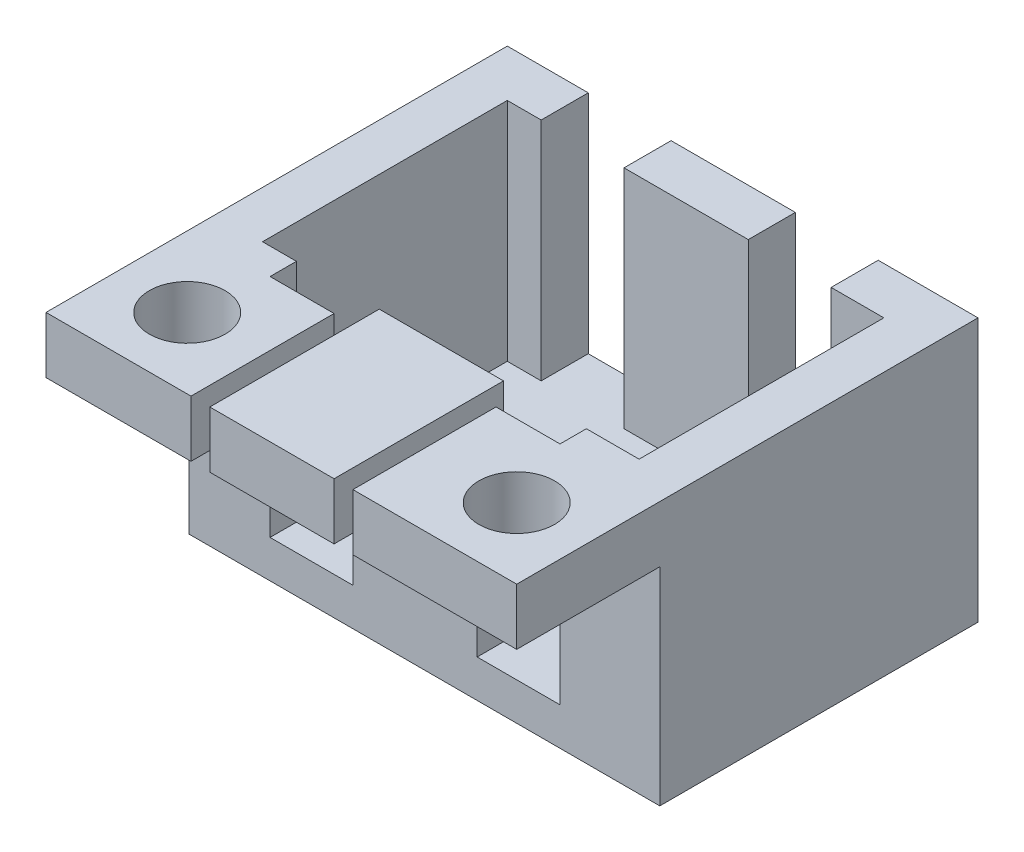
ISO-10303-21;
HEADER;
FILE_DESCRIPTION(('STEP AP214'),'2;1');
FILE_NAME('part.step','',(''),(''),'','','');
FILE_SCHEMA(('AUTOMOTIVE_DESIGN { 1 0 10303 214 1 1 1 1 }'));
ENDSEC;
DATA;
#1=APPLICATION_CONTEXT('core data for automotive mechanical design processes');
#2=APPLICATION_PROTOCOL_DEFINITION('international standard','automotive_design',2000,#1);
#3=PRODUCT_CONTEXT('',#1,'mechanical');
#4=PRODUCT('Part','Part','',(#3));
#5=PRODUCT_RELATED_PRODUCT_CATEGORY('part','',(#4));
#6=PRODUCT_DEFINITION_FORMATION('','',#4);
#7=PRODUCT_DEFINITION_CONTEXT('part definition',#1,'design');
#8=PRODUCT_DEFINITION('design','',#6,#7);
#9=PRODUCT_DEFINITION_SHAPE('','',#8);
#10=(LENGTH_UNIT() NAMED_UNIT(*) SI_UNIT(.MILLI.,.METRE.));
#11=(NAMED_UNIT(*) PLANE_ANGLE_UNIT() SI_UNIT($,.RADIAN.));
#12=(NAMED_UNIT(*) SI_UNIT($,.STERADIAN.) SOLID_ANGLE_UNIT());
#13=UNCERTAINTY_MEASURE_WITH_UNIT(LENGTH_MEASURE(1.E-05),#10,'distance_accuracy_value','');
#14=(GEOMETRIC_REPRESENTATION_CONTEXT(3) GLOBAL_UNCERTAINTY_ASSIGNED_CONTEXT((#13)) GLOBAL_UNIT_ASSIGNED_CONTEXT((#10,
#11,#12)) REPRESENTATION_CONTEXT('',''));
#15=CARTESIAN_POINT('',(0.,0.,0.));
#16=DIRECTION('',(0.,0.,1.));
#17=DIRECTION('',(1.,0.,0.));
#18=AXIS2_PLACEMENT_3D('',#15,#16,#17);
#19=CARTESIAN_POINT('',(-15.875,16.51,8.9535));
#20=DIRECTION('',(0.,1.,0.));
#21=DIRECTION('',(0.,0.,1.));
#22=AXIS2_PLACEMENT_3D('',#19,#20,#21);
#23=PLANE('',#22);
#24=DIRECTION('',(-1.,0.,0.));
#25=VECTOR('',#24,1.);
#26=CARTESIAN_POINT('',(-15.875,16.51,20.3835));
#27=LINE('',#26,#25);
#28=CARTESIAN_POINT('',(3.556,16.51,20.3835));
#29=VERTEX_POINT('',#28);
#30=CARTESIAN_POINT('',(-4.826,16.51,20.3835));
#31=VERTEX_POINT('',#30);
#32=EDGE_CURVE('E268',#29,#31,#27,.T.);
#33=ORIENTED_EDGE('',*,*,#32,.F.);
#34=DIRECTION('',(0.,0.,-1.));
#35=VECTOR('',#34,1.);
#36=CARTESIAN_POINT('',(3.556,16.51,10.7315));
#37=LINE('',#36,#35);
#38=CARTESIAN_POINT('',(3.556,16.51,8.9535));
#39=VERTEX_POINT('',#38);
#40=EDGE_CURVE('E249',#29,#39,#37,.T.);
#41=ORIENTED_EDGE('',*,*,#40,.T.);
#42=DIRECTION('',(-1.,0.,0.));
#43=VECTOR('',#42,1.);
#44=CARTESIAN_POINT('',(-15.875,16.51,8.9535));
#45=LINE('',#44,#43);
#46=CARTESIAN_POINT('',(-4.826,16.51,8.9535));
#47=VERTEX_POINT('',#46);
#48=EDGE_CURVE('E596',#39,#47,#45,.T.);
#49=ORIENTED_EDGE('',*,*,#48,.T.);
#50=DIRECTION('',(0.,0.,-1.));
#51=VECTOR('',#50,1.);
#52=CARTESIAN_POINT('',(-4.826,16.51,10.7315));
#53=LINE('',#52,#51);
#54=EDGE_CURVE('E274',#31,#47,#53,.T.);
#55=ORIENTED_EDGE('',*,*,#54,.F.);
#56=EDGE_LOOP('',(#33,#41,#49,#55));
#57=FACE_BOUND('',#56,.T.);
#58=ADVANCED_FACE('F36',(#57),#23,.T.);
#59=CARTESIAN_POINT('',(-15.875,12.7,20.3835));
#60=DIRECTION('',(0.,1.,0.));
#61=DIRECTION('',(0.,0.,1.));
#62=AXIS2_PLACEMENT_3D('',#59,#60,#61);
#63=PLANE('',#62);
#64=DIRECTION('',(1.,0.,0.));
#65=VECTOR('',#64,1.);
#66=CARTESIAN_POINT('',(-15.875,12.7,10.7315));
#67=LINE('',#66,#65);
#68=CARTESIAN_POINT('',(-4.826,12.7,10.7315));
#69=VERTEX_POINT('',#68);
#70=CARTESIAN_POINT('',(3.556,12.7,10.7315));
#71=VERTEX_POINT('',#70);
#72=EDGE_CURVE('E290',#69,#71,#67,.T.);
#73=ORIENTED_EDGE('',*,*,#72,.T.);
#74=DIRECTION('',(0.,0.,1.));
#75=VECTOR('',#74,1.);
#76=CARTESIAN_POINT('',(3.556,12.7,20.3835));
#77=LINE('',#76,#75);
#78=CARTESIAN_POINT('',(3.556,12.7,20.3835));
#79=VERTEX_POINT('',#78);
#80=EDGE_CURVE('E493',#71,#79,#77,.T.);
#81=ORIENTED_EDGE('',*,*,#80,.T.);
#82=DIRECTION('',(1.,0.,0.));
#83=VECTOR('',#82,1.);
#84=CARTESIAN_POINT('',(-15.875,12.7,20.3835));
#85=LINE('',#84,#83);
#86=CARTESIAN_POINT('',(-4.826,12.7,20.3835));
#87=VERTEX_POINT('',#86);
#88=EDGE_CURVE('E271',#87,#79,#85,.T.);
#89=ORIENTED_EDGE('',*,*,#88,.F.);
#90=DIRECTION('',(0.,0.,-1.));
#91=VECTOR('',#90,1.);
#92=CARTESIAN_POINT('',(-4.826,12.7,20.3835));
#93=LINE('',#92,#91);
#94=EDGE_CURVE('E501',#87,#69,#93,.T.);
#95=ORIENTED_EDGE('',*,*,#94,.T.);
#96=EDGE_LOOP('',(#73,#81,#89,#95));
#97=FACE_BOUND('',#96,.T.);
#98=ADVANCED_FACE('F532',(#97),#63,.F.);
#99=CARTESIAN_POINT('',(0.,0.,20.3835));
#100=DIRECTION('',(0.,0.,1.));
#101=DIRECTION('',(1.,0.,0.));
#102=AXIS2_PLACEMENT_3D('',#99,#100,#101);
#103=PLANE('',#102);
#104=DIRECTION('',(0.,1.,0.));
#105=VECTOR('',#104,1.);
#106=CARTESIAN_POINT('',(3.556,-1.270025,20.3835));
#107=LINE('',#106,#105);
#108=EDGE_CURVE('E252',#79,#29,#107,.T.);
#109=ORIENTED_EDGE('',*,*,#108,.T.);
#110=ORIENTED_EDGE('',*,*,#32,.T.);
#111=DIRECTION('',(0.,1.,0.));
#112=VECTOR('',#111,1.);
#113=CARTESIAN_POINT('',(-4.826,0.,20.3835));
#114=LINE('',#113,#112);
#115=EDGE_CURVE('E44',#87,#31,#114,.T.);
#116=ORIENTED_EDGE('',*,*,#115,.F.);
#117=ORIENTED_EDGE('',*,*,#88,.T.);
#118=EDGE_LOOP('',(#109,#110,#116,#117));
#119=FACE_BOUND('',#118,.T.);
#120=ADVANCED_FACE('F266',(#119),#103,.T.);
#121=DIRECTION('',(0.,0.,-1.));
#122=VECTOR('',#121,1.);
#123=CARTESIAN_POINT('',(4.826,16.51,10.7315));
#124=LINE('',#123,#122);
#125=CARTESIAN_POINT('',(4.826,16.51,20.3835));
#126=VERTEX_POINT('',#125);
#127=CARTESIAN_POINT('',(4.826,16.51,10.7315));
#128=VERTEX_POINT('',#127);
#129=EDGE_CURVE('E51',#126,#128,#124,.T.);
#130=ORIENTED_EDGE('',*,*,#129,.F.);
#131=CARTESIAN_POINT('',(15.875,16.51,20.3835));
#132=VERTEX_POINT('',#131);
#133=EDGE_CURVE('E276',#132,#126,#27,.T.);
#134=ORIENTED_EDGE('',*,*,#133,.F.);
#135=DIRECTION('',(0.,0.,1.));
#136=VECTOR('',#135,1.);
#137=CARTESIAN_POINT('',(15.875,16.51,8.9535));
#138=LINE('',#137,#136);
#139=CARTESIAN_POINT('',(15.875,16.51,-10.7315));
#140=VERTEX_POINT('',#139);
#141=EDGE_CURVE('E446',#140,#132,#138,.T.);
#142=ORIENTED_EDGE('',*,*,#141,.F.);
#143=DIRECTION('',(1.,0.,0.));
#144=VECTOR('',#143,1.);
#145=CARTESIAN_POINT('',(15.875,16.51,-10.7315));
#146=LINE('',#145,#144);
#147=CARTESIAN_POINT('',(9.144,16.51,-10.7315));
#148=VERTEX_POINT('',#147);
#149=EDGE_CURVE('E393',#148,#140,#146,.T.);
#150=ORIENTED_EDGE('',*,*,#149,.F.);
#151=DIRECTION('',(0.,0.,-1.));
#152=VECTOR('',#151,1.);
#153=CARTESIAN_POINT('',(9.144,16.51,10.7315));
#154=LINE('',#153,#152);
#155=CARTESIAN_POINT('',(9.144,16.51,-7.5565));
#156=VERTEX_POINT('',#155);
#157=EDGE_CURVE('E261',#156,#148,#154,.T.);
#158=ORIENTED_EDGE('',*,*,#157,.F.);
#159=DIRECTION('',(1.,0.,0.));
#160=VECTOR('',#159,1.);
#161=CARTESIAN_POINT('',(-500000.,16.5100000002277,-7.5565));
#162=LINE('',#161,#160);
#163=CARTESIAN_POINT('',(12.7,16.51,-7.5565));
#164=VERTEX_POINT('',#163);
#165=EDGE_CURVE('E370',#156,#164,#162,.T.);
#166=ORIENTED_EDGE('',*,*,#165,.T.);
#167=DIRECTION('',(0.,0.,1.));
#168=VECTOR('',#167,1.);
#169=CARTESIAN_POINT('',(12.7,16.51,-10.7315));
#170=LINE('',#169,#168);
#171=CARTESIAN_POINT('',(12.7,16.51,8.9535));
#172=VERTEX_POINT('',#171);
#173=EDGE_CURVE('E391',#164,#172,#170,.T.);
#174=ORIENTED_EDGE('',*,*,#173,.T.);
#175=CARTESIAN_POINT('',(9.144,16.51,8.9535));
#176=VERTEX_POINT('',#175);
#177=EDGE_CURVE('E403',#172,#176,#45,.T.);
#178=ORIENTED_EDGE('',*,*,#177,.T.);
#179=CARTESIAN_POINT('',(9.144,16.51,10.7315));
#180=VERTEX_POINT('',#179);
#181=EDGE_CURVE('E340',#180,#176,#154,.T.);
#182=ORIENTED_EDGE('',*,*,#181,.F.);
#183=DIRECTION('',(-1.,0.,0.));
#184=VECTOR('',#183,1.);
#185=CARTESIAN_POINT('',(-15.875,16.51,10.7315));
#186=LINE('',#185,#184);
#187=EDGE_CURVE('E464',#180,#128,#186,.T.);
#188=ORIENTED_EDGE('',*,*,#187,.T.);
#189=EDGE_LOOP('',(#130,#134,#142,#150,#158,#166,#174,#178,#182,#188));
#190=FACE_BOUND('',#189,.T.);
#191=CARTESIAN_POINT('',(11.1125,16.51,15.621));
#192=DIRECTION('',(0.,1.,0.));
#193=DIRECTION('',(0.,0.,1.));
#194=AXIS2_PLACEMENT_3D('',#191,#192,#193);
#195=CIRCLE('',#194,2.55269999999999);
#196=CARTESIAN_POINT('',(11.1125,16.51,18.1737));
#197=VERTEX_POINT('',#196);
#198=EDGE_CURVE('E503',#197,#197,#195,.T.);
#199=ORIENTED_EDGE('',*,*,#198,.F.);
#200=EDGE_LOOP('',(#199));
#201=FACE_BOUND('',#200,.T.);
#202=ADVANCED_FACE('F482',(#190,#201),#23,.T.);
#203=CARTESIAN_POINT('',(11.1125,12.7,15.621));
#204=DIRECTION('',(0.,1.,0.));
#205=DIRECTION('',(0.,0.,1.));
#206=AXIS2_PLACEMENT_3D('',#203,#204,#205);
#207=CIRCLE('',#206,2.55269999999999);
#208=CARTESIAN_POINT('',(11.1125,12.7,18.1737));
#209=VERTEX_POINT('',#208);
#210=EDGE_CURVE('E506',#209,#209,#207,.T.);
#211=ORIENTED_EDGE('',*,*,#210,.T.);
#212=EDGE_LOOP('',(#211));
#213=FACE_BOUND('',#212,.T.);
#214=CARTESIAN_POINT('',(4.826,12.7,20.3835));
#215=VERTEX_POINT('',#214);
#216=CARTESIAN_POINT('',(15.875,12.7,20.3835));
#217=VERTEX_POINT('',#216);
#218=EDGE_CURVE('E463',#215,#217,#85,.T.);
#219=ORIENTED_EDGE('',*,*,#218,.F.);
#220=DIRECTION('',(0.,0.,-1.));
#221=VECTOR('',#220,1.);
#222=CARTESIAN_POINT('',(4.826,12.7,20.3835));
#223=LINE('',#222,#221);
#224=CARTESIAN_POINT('',(4.826,12.7,10.7315));
#225=VERTEX_POINT('',#224);
#226=EDGE_CURVE('E489',#215,#225,#223,.T.);
#227=ORIENTED_EDGE('',*,*,#226,.T.);
#228=CARTESIAN_POINT('',(9.144,12.7,10.7315));
#229=VERTEX_POINT('',#228);
#230=EDGE_CURVE('E285',#225,#229,#67,.T.);
#231=ORIENTED_EDGE('',*,*,#230,.T.);
#232=CARTESIAN_POINT('',(15.875,12.7,10.7315));
#233=VERTEX_POINT('',#232);
#234=EDGE_CURVE('E295',#229,#233,#67,.T.);
#235=ORIENTED_EDGE('',*,*,#234,.T.);
#236=DIRECTION('',(0.,0.,-1.));
#237=VECTOR('',#236,1.);
#238=CARTESIAN_POINT('',(15.875,12.7,20.3835));
#239=LINE('',#238,#237);
#240=EDGE_CURVE('E280',#217,#233,#239,.T.);
#241=ORIENTED_EDGE('',*,*,#240,.F.);
#242=EDGE_LOOP('',(#219,#227,#231,#235,#241));
#243=FACE_BOUND('',#242,.T.);
#244=ADVANCED_FACE('F539',(#213,#243),#63,.F.);
#245=DIRECTION('',(0.,1.,0.));
#246=VECTOR('',#245,1.);
#247=CARTESIAN_POINT('',(4.826,-1.270025,20.3835));
#248=LINE('',#247,#246);
#249=EDGE_CURVE('E272',#215,#126,#248,.T.);
#250=ORIENTED_EDGE('',*,*,#249,.F.);
#251=ORIENTED_EDGE('',*,*,#218,.T.);
#252=DIRECTION('',(0.,1.,0.));
#253=VECTOR('',#252,1.);
#254=CARTESIAN_POINT('',(15.875,16.51,20.3835));
#255=LINE('',#254,#253);
#256=EDGE_CURVE('E281',#217,#132,#255,.T.);
#257=ORIENTED_EDGE('',*,*,#256,.T.);
#258=ORIENTED_EDGE('',*,*,#133,.T.);
#259=EDGE_LOOP('',(#250,#251,#257,#258));
#260=FACE_BOUND('',#259,.T.);
#261=ADVANCED_FACE('F475',(#260),#103,.T.);
#262=CARTESIAN_POINT('',(-15.875,1.27,10.7315));
#263=DIRECTION('',(0.,0.,-1.));
#264=DIRECTION('',(-1.,0.,0.));
#265=AXIS2_PLACEMENT_3D('',#262,#263,#264);
#266=PLANE('',#265);
#267=DIRECTION('',(-1.,0.,0.));
#268=VECTOR('',#267,1.);
#269=CARTESIAN_POINT('',(9.144,1.27,10.7315));
#270=LINE('',#269,#268);
#271=CARTESIAN_POINT('',(9.144,1.27,10.7315));
#272=VERTEX_POINT('',#271);
#273=CARTESIAN_POINT('',(3.556,1.27000000000001,10.7315));
#274=VERTEX_POINT('',#273);
#275=EDGE_CURVE('E625',#272,#274,#270,.T.);
#276=ORIENTED_EDGE('',*,*,#275,.T.);
#277=DIRECTION('',(0.,1.,0.));
#278=VECTOR('',#277,1.);
#279=CARTESIAN_POINT('',(3.556,16.51,10.7315));
#280=LINE('',#279,#278);
#281=EDGE_CURVE('E627',#274,#71,#280,.T.);
#282=ORIENTED_EDGE('',*,*,#281,.T.);
#283=ORIENTED_EDGE('',*,*,#72,.F.);
#284=DIRECTION('',(0.,-1.,0.));
#285=VECTOR('',#284,1.);
#286=CARTESIAN_POINT('',(-4.826,16.51,10.7315));
#287=LINE('',#286,#285);
#288=CARTESIAN_POINT('',(-4.826,1.27000000000001,10.7315));
#289=VERTEX_POINT('',#288);
#290=EDGE_CURVE('E332',#69,#289,#287,.T.);
#291=ORIENTED_EDGE('',*,*,#290,.T.);
#292=DIRECTION('',(-1.,0.,0.));
#293=VECTOR('',#292,1.);
#294=CARTESIAN_POINT('',(-4.826,1.27000000000001,10.7315));
#295=LINE('',#294,#293);
#296=CARTESIAN_POINT('',(-10.414,1.27000000000001,10.7315));
#297=VERTEX_POINT('',#296);
#298=EDGE_CURVE('E316',#289,#297,#295,.T.);
#299=ORIENTED_EDGE('',*,*,#298,.T.);
#300=DIRECTION('',(0.,1.,0.));
#301=VECTOR('',#300,1.);
#302=CARTESIAN_POINT('',(-10.414,16.51,10.7315));
#303=LINE('',#302,#301);
#304=CARTESIAN_POINT('',(-10.414,12.7,10.7315));
#305=VERTEX_POINT('',#304);
#306=EDGE_CURVE('E315',#297,#305,#303,.T.);
#307=ORIENTED_EDGE('',*,*,#306,.T.);
#308=CARTESIAN_POINT('',(-15.875,12.7,10.7315));
#309=VERTEX_POINT('',#308);
#310=EDGE_CURVE('E299',#309,#305,#67,.T.);
#311=ORIENTED_EDGE('',*,*,#310,.F.);
#312=DIRECTION('',(0.,-1.,0.));
#313=VECTOR('',#312,1.);
#314=CARTESIAN_POINT('',(-15.875,1.27,10.7315));
#315=LINE('',#314,#313);
#316=CARTESIAN_POINT('',(-15.875,-1.27,10.7315));
#317=VERTEX_POINT('',#316);
#318=EDGE_CURVE('E423',#309,#317,#315,.T.);
#319=ORIENTED_EDGE('',*,*,#318,.T.);
#320=DIRECTION('',(1.,0.,0.));
#321=VECTOR('',#320,1.);
#322=CARTESIAN_POINT('',(-15.875,-1.27,10.7315));
#323=LINE('',#322,#321);
#324=CARTESIAN_POINT('',(15.875,-1.27,10.7315));
#325=VERTEX_POINT('',#324);
#326=EDGE_CURVE('E440',#317,#325,#323,.T.);
#327=ORIENTED_EDGE('',*,*,#326,.T.);
#328=DIRECTION('',(0.,-1.,0.));
#329=VECTOR('',#328,1.);
#330=CARTESIAN_POINT('',(15.875,1.27,10.7315));
#331=LINE('',#330,#329);
#332=EDGE_CURVE('E425',#233,#325,#331,.T.);
#333=ORIENTED_EDGE('',*,*,#332,.F.);
#334=ORIENTED_EDGE('',*,*,#234,.F.);
#335=DIRECTION('',(0.,-1.,0.));
#336=VECTOR('',#335,1.);
#337=CARTESIAN_POINT('',(9.144,16.51,10.7315));
#338=LINE('',#337,#336);
#339=EDGE_CURVE('E622',#229,#272,#338,.T.);
#340=ORIENTED_EDGE('',*,*,#339,.T.);
#341=EDGE_LOOP('',(#276,#282,#283,#291,#299,#307,#311,#319,#327,#333,#334,#340));
#342=FACE_BOUND('',#341,.T.);
#343=ADVANCED_FACE('F568',(#342),#266,.F.);
#344=CARTESIAN_POINT('',(0.,0.,8.9535));
#345=DIRECTION('',(0.,0.,-1.));
#346=DIRECTION('',(-1.,0.,0.));
#347=AXIS2_PLACEMENT_3D('',#344,#345,#346);
#348=PLANE('',#347);
#349=DIRECTION('',(0.,-1.,0.));
#350=VECTOR('',#349,1.);
#351=CARTESIAN_POINT('',(-4.826,0.,8.9535));
#352=LINE('',#351,#350);
#353=CARTESIAN_POINT('',(-4.826,1.27,8.9535));
#354=VERTEX_POINT('',#353);
#355=EDGE_CURVE('E616',#47,#354,#352,.T.);
#356=ORIENTED_EDGE('',*,*,#355,.F.);
#357=ORIENTED_EDGE('',*,*,#48,.F.);
#358=DIRECTION('',(0.,1.,0.));
#359=VECTOR('',#358,1.);
#360=CARTESIAN_POINT('',(3.556,0.,8.9535));
#361=LINE('',#360,#359);
#362=CARTESIAN_POINT('',(3.556,1.27000000000001,8.9535));
#363=VERTEX_POINT('',#362);
#364=EDGE_CURVE('E256',#363,#39,#361,.T.);
#365=ORIENTED_EDGE('',*,*,#364,.F.);
#366=DIRECTION('',(1.,0.,0.));
#367=VECTOR('',#366,1.);
#368=CARTESIAN_POINT('',(-15.875,1.27,8.9535));
#369=LINE('',#368,#367);
#370=EDGE_CURVE('E415',#354,#363,#369,.T.);
#371=ORIENTED_EDGE('',*,*,#370,.F.);
#372=EDGE_LOOP('',(#356,#357,#365,#371));
#373=FACE_BOUND('',#372,.T.);
#374=ADVANCED_FACE('F560',(#373),#348,.T.);
#375=CARTESIAN_POINT('',(-4.826,16.51,-7.5565));
#376=VERTEX_POINT('',#375);
#377=CARTESIAN_POINT('',(-4.826,16.51,-10.7315));
#378=VERTEX_POINT('',#377);
#379=EDGE_CURVE('E333',#376,#378,#53,.T.);
#380=ORIENTED_EDGE('',*,*,#379,.F.);
#381=CARTESIAN_POINT('',(3.556,16.51,-7.5565));
#382=VERTEX_POINT('',#381);
#383=EDGE_CURVE('E376',#376,#382,#162,.T.);
#384=ORIENTED_EDGE('',*,*,#383,.T.);
#385=CARTESIAN_POINT('',(3.556,16.51,-10.7315));
#386=VERTEX_POINT('',#385);
#387=EDGE_CURVE('E262',#382,#386,#37,.T.);
#388=ORIENTED_EDGE('',*,*,#387,.T.);
#389=EDGE_CURVE('E392',#378,#386,#146,.T.);
#390=ORIENTED_EDGE('',*,*,#389,.F.);
#391=EDGE_LOOP('',(#380,#384,#388,#390));
#392=FACE_BOUND('',#391,.T.);
#393=ADVANCED_FACE('F543',(#392),#23,.T.);
#394=CARTESIAN_POINT('',(-500000.,16.5100000002277,-7.5565));
#395=DIRECTION('',(0.,0.,-1.));
#396=DIRECTION('',(0.,1.,0.));
#397=AXIS2_PLACEMENT_3D('',#394,#395,#396);
#398=PLANE('',#397);
#399=ORIENTED_EDGE('',*,*,#383,.F.);
#400=DIRECTION('',(0.,-1.,0.));
#401=VECTOR('',#400,1.);
#402=CARTESIAN_POINT('',(-4.82599999998001,16.5100000002277,-7.5565));
#403=LINE('',#402,#401);
#404=CARTESIAN_POINT('',(-4.826,1.27,-7.5565));
#405=VERTEX_POINT('',#404);
#406=EDGE_CURVE('E420',#376,#405,#403,.T.);
#407=ORIENTED_EDGE('',*,*,#406,.T.);
#408=DIRECTION('',(1.,0.,0.));
#409=VECTOR('',#408,1.);
#410=CARTESIAN_POINT('',(-500000.,1.27000000022766,-7.5565));
#411=LINE('',#410,#409);
#412=CARTESIAN_POINT('',(3.55600000000322,1.27,-7.5565));
#413=VERTEX_POINT('',#412);
#414=EDGE_CURVE('E371',#405,#413,#411,.T.);
#415=ORIENTED_EDGE('',*,*,#414,.T.);
#416=DIRECTION('',(0.,1.,0.));
#417=VECTOR('',#416,1.);
#418=CARTESIAN_POINT('',(3.55600000000322,16.5100000002277,-7.5565));
#419=LINE('',#418,#417);
#420=EDGE_CURVE('E424',#413,#382,#419,.T.);
#421=ORIENTED_EDGE('',*,*,#420,.T.);
#422=EDGE_LOOP('',(#399,#407,#415,#421));
#423=FACE_BOUND('',#422,.T.);
#424=ADVANCED_FACE('F554',(#423),#398,.F.);
#425=DIRECTION('',(0.,-1.,0.));
#426=VECTOR('',#425,1.);
#427=CARTESIAN_POINT('',(9.144,0.,8.9535));
#428=LINE('',#427,#426);
#429=CARTESIAN_POINT('',(9.144,1.27,8.9535));
#430=VERTEX_POINT('',#429);
#431=EDGE_CURVE('E361',#176,#430,#428,.T.);
#432=ORIENTED_EDGE('',*,*,#431,.F.);
#433=ORIENTED_EDGE('',*,*,#177,.F.);
#434=DIRECTION('',(0.,1.,0.));
#435=VECTOR('',#434,1.);
#436=CARTESIAN_POINT('',(12.7,16.51,8.9535));
#437=LINE('',#436,#435);
#438=CARTESIAN_POINT('',(12.7,1.27,8.9535));
#439=VERTEX_POINT('',#438);
#440=EDGE_CURVE('E387',#439,#172,#437,.T.);
#441=ORIENTED_EDGE('',*,*,#440,.F.);
#442=EDGE_CURVE('E400',#430,#439,#369,.T.);
#443=ORIENTED_EDGE('',*,*,#442,.F.);
#444=EDGE_LOOP('',(#432,#433,#441,#443));
#445=FACE_BOUND('',#444,.T.);
#446=ADVANCED_FACE('F566',(#445),#348,.T.);
#447=ORIENTED_EDGE('',*,*,#165,.F.);
#448=DIRECTION('',(0.,-1.,0.));
#449=VECTOR('',#448,1.);
#450=CARTESIAN_POINT('',(9.14399999999205,16.5100000002277,-7.5565));
#451=LINE('',#450,#449);
#452=CARTESIAN_POINT('',(9.144,1.27,-7.5565));
#453=VERTEX_POINT('',#452);
#454=EDGE_CURVE('E416',#156,#453,#451,.T.);
#455=ORIENTED_EDGE('',*,*,#454,.T.);
#456=CARTESIAN_POINT('',(12.7,1.27,-7.5565));
#457=VERTEX_POINT('',#456);
#458=EDGE_CURVE('E366',#453,#457,#411,.T.);
#459=ORIENTED_EDGE('',*,*,#458,.T.);
#460=DIRECTION('',(0.,1.,0.));
#461=VECTOR('',#460,1.);
#462=CARTESIAN_POINT('',(12.7,16.51,-7.5565));
#463=LINE('',#462,#461);
#464=EDGE_CURVE('E363',#457,#164,#463,.T.);
#465=ORIENTED_EDGE('',*,*,#464,.T.);
#466=EDGE_LOOP('',(#447,#455,#459,#465));
#467=FACE_BOUND('',#466,.T.);
#468=ADVANCED_FACE('F555',(#467),#398,.F.);
#469=CARTESIAN_POINT('',(0.,1.27,0.));
#470=DIRECTION('',(0.,1.,0.));
#471=DIRECTION('',(0.,0.,1.));
#472=AXIS2_PLACEMENT_3D('',#469,#470,#471);
#473=PLANE('',#472);
#474=CARTESIAN_POINT('',(-12.7,1.27,8.9535));
#475=VERTEX_POINT('',#474);
#476=CARTESIAN_POINT('',(-10.414,1.27,8.9535));
#477=VERTEX_POINT('',#476);
#478=EDGE_CURVE('E408',#475,#477,#369,.T.);
#479=ORIENTED_EDGE('',*,*,#478,.T.);
#480=DIRECTION('',(0.,0.,-1.));
#481=VECTOR('',#480,1.);
#482=CARTESIAN_POINT('',(-10.414,1.27000000000001,10.7315));
#483=LINE('',#482,#481);
#484=EDGE_CURVE('E607',#297,#477,#483,.T.);
#485=ORIENTED_EDGE('',*,*,#484,.F.);
#486=ORIENTED_EDGE('',*,*,#298,.F.);
#487=DIRECTION('',(0.,0.,-1.));
#488=VECTOR('',#487,1.);
#489=CARTESIAN_POINT('',(-4.826,1.27000000000001,10.7315));
#490=LINE('',#489,#488);
#491=EDGE_CURVE('E621',#289,#354,#490,.T.);
#492=ORIENTED_EDGE('',*,*,#491,.T.);
#493=ORIENTED_EDGE('',*,*,#370,.T.);
#494=DIRECTION('',(0.,0.,-1.));
#495=VECTOR('',#494,1.);
#496=CARTESIAN_POINT('',(3.556,1.27000000000001,10.7315));
#497=LINE('',#496,#495);
#498=EDGE_CURVE('E353',#274,#363,#497,.T.);
#499=ORIENTED_EDGE('',*,*,#498,.F.);
#500=ORIENTED_EDGE('',*,*,#275,.F.);
#501=DIRECTION('',(0.,0.,-1.));
#502=VECTOR('',#501,1.);
#503=CARTESIAN_POINT('',(9.144,1.27,10.7315));
#504=LINE('',#503,#502);
#505=EDGE_CURVE('E356',#272,#430,#504,.T.);
#506=ORIENTED_EDGE('',*,*,#505,.T.);
#507=ORIENTED_EDGE('',*,*,#442,.T.);
#508=DIRECTION('',(0.,0.,1.));
#509=VECTOR('',#508,1.);
#510=CARTESIAN_POINT('',(12.7,1.27,-10.7315));
#511=LINE('',#510,#509);
#512=EDGE_CURVE('E397',#457,#439,#511,.T.);
#513=ORIENTED_EDGE('',*,*,#512,.F.);
#514=ORIENTED_EDGE('',*,*,#458,.F.);
#515=CARTESIAN_POINT('',(9.144,1.27,-10.7315));
#516=VERTEX_POINT('',#515);
#517=EDGE_CURVE('E359',#453,#516,#504,.T.);
#518=ORIENTED_EDGE('',*,*,#517,.T.);
#519=DIRECTION('',(-1.,0.,0.));
#520=VECTOR('',#519,1.);
#521=CARTESIAN_POINT('',(9.144,1.27,-10.7315));
#522=LINE('',#521,#520);
#523=CARTESIAN_POINT('',(3.556,1.27,-10.7315));
#524=VERTEX_POINT('',#523);
#525=EDGE_CURVE('E631',#516,#524,#522,.T.);
#526=ORIENTED_EDGE('',*,*,#525,.T.);
#527=EDGE_CURVE('E355',#413,#524,#497,.T.);
#528=ORIENTED_EDGE('',*,*,#527,.F.);
#529=ORIENTED_EDGE('',*,*,#414,.F.);
#530=CARTESIAN_POINT('',(-4.826,1.27,-10.7315));
#531=VERTEX_POINT('',#530);
#532=EDGE_CURVE('E323',#405,#531,#490,.T.);
#533=ORIENTED_EDGE('',*,*,#532,.T.);
#534=DIRECTION('',(-1.,0.,0.));
#535=VECTOR('',#534,1.);
#536=CARTESIAN_POINT('',(-4.826,1.27,-10.7315));
#537=LINE('',#536,#535);
#538=CARTESIAN_POINT('',(-10.414,1.27,-10.7315));
#539=VERTEX_POINT('',#538);
#540=EDGE_CURVE('E327',#531,#539,#537,.T.);
#541=ORIENTED_EDGE('',*,*,#540,.T.);
#542=CARTESIAN_POINT('',(-10.4140000000257,1.27000000000001,-7.5565));
#543=VERTEX_POINT('',#542);
#544=EDGE_CURVE('E1004',#543,#539,#483,.T.);
#545=ORIENTED_EDGE('',*,*,#544,.F.);
#546=CARTESIAN_POINT('',(-12.6999999999953,1.27000000000001,-7.5565));
#547=VERTEX_POINT('',#546);
#548=EDGE_CURVE('E367',#547,#543,#411,.T.);
#549=ORIENTED_EDGE('',*,*,#548,.F.);
#550=DIRECTION('',(0.,0.,1.));
#551=VECTOR('',#550,1.);
#552=CARTESIAN_POINT('',(-12.7,1.27,-10.7315));
#553=LINE('',#552,#551);
#554=EDGE_CURVE('E382',#547,#475,#553,.T.);
#555=ORIENTED_EDGE('',*,*,#554,.T.);
#556=EDGE_LOOP('',(#479,#485,#486,#492,#493,#499,#500,#506,#507,#513,#514,#518,#526,#528,#529,
#533,#541,#545,#549,#555));
#557=FACE_BOUND('',#556,.T.);
#558=ADVANCED_FACE('F605',(#557),#473,.T.);
#559=CARTESIAN_POINT('',(12.7,16.51,-10.7315));
#560=DIRECTION('',(1.,0.,0.));
#561=DIRECTION('',(0.,0.,-1.));
#562=AXIS2_PLACEMENT_3D('',#559,#560,#561);
#563=PLANE('',#562);
#564=ORIENTED_EDGE('',*,*,#464,.F.);
#565=ORIENTED_EDGE('',*,*,#512,.T.);
#566=ORIENTED_EDGE('',*,*,#440,.T.);
#567=ORIENTED_EDGE('',*,*,#173,.F.);
#568=EDGE_LOOP('',(#564,#565,#566,#567));
#569=FACE_BOUND('',#568,.T.);
#570=ADVANCED_FACE('F590',(#569),#563,.F.);
#571=CARTESIAN_POINT('',(-12.7,16.51,-10.7315));
#572=DIRECTION('',(-1.,0.,0.));
#573=DIRECTION('',(0.,0.,1.));
#574=AXIS2_PLACEMENT_3D('',#571,#572,#573);
#575=PLANE('',#574);
#576=DIRECTION('',(0.,1.,0.));
#577=VECTOR('',#576,1.);
#578=CARTESIAN_POINT('',(-12.6999999999953,16.5100000002277,-7.5565));
#579=LINE('',#578,#577);
#580=CARTESIAN_POINT('',(-12.6999999999953,16.51,-7.5565));
#581=VERTEX_POINT('',#580);
#582=EDGE_CURVE('E375',#547,#581,#579,.T.);
#583=ORIENTED_EDGE('',*,*,#582,.T.);
#584=DIRECTION('',(0.,0.,1.));
#585=VECTOR('',#584,1.);
#586=CARTESIAN_POINT('',(-12.7,16.51,-10.7315));
#587=LINE('',#586,#585);
#588=CARTESIAN_POINT('',(-12.7,16.51,8.9535));
#589=VERTEX_POINT('',#588);
#590=EDGE_CURVE('E384',#581,#589,#587,.T.);
#591=ORIENTED_EDGE('',*,*,#590,.T.);
#592=DIRECTION('',(0.,-1.,0.));
#593=VECTOR('',#592,1.);
#594=CARTESIAN_POINT('',(-12.7,16.51,8.9535));
#595=LINE('',#594,#593);
#596=EDGE_CURVE('E379',#589,#475,#595,.T.);
#597=ORIENTED_EDGE('',*,*,#596,.T.);
#598=ORIENTED_EDGE('',*,*,#554,.F.);
#599=EDGE_LOOP('',(#583,#591,#597,#598));
#600=FACE_BOUND('',#599,.T.);
#601=ADVANCED_FACE('F831',(#600),#575,.F.);
#602=DIRECTION('',(0.,1.,0.));
#603=VECTOR('',#602,1.);
#604=CARTESIAN_POINT('',(-10.414,0.,8.9535));
#605=LINE('',#604,#603);
#606=CARTESIAN_POINT('',(-10.414,16.51,8.9535));
#607=VERTEX_POINT('',#606);
#608=EDGE_CURVE('E339',#477,#607,#605,.T.);
#609=ORIENTED_EDGE('',*,*,#608,.F.);
#610=ORIENTED_EDGE('',*,*,#478,.F.);
#611=ORIENTED_EDGE('',*,*,#596,.F.);
#612=EDGE_CURVE('E597',#607,#589,#45,.T.);
#613=ORIENTED_EDGE('',*,*,#612,.F.);
#614=EDGE_LOOP('',(#609,#610,#611,#613));
#615=FACE_BOUND('',#614,.T.);
#616=ADVANCED_FACE('F570',(#615),#348,.T.);
#617=CARTESIAN_POINT('',(-15.875,1.27,10.7315));
#618=DIRECTION('',(1.,0.,0.));
#619=DIRECTION('',(0.,0.,-1.));
#620=AXIS2_PLACEMENT_3D('',#617,#618,#619);
#621=PLANE('',#620);
#622=DIRECTION('',(0.,0.,1.));
#623=VECTOR('',#622,1.);
#624=CARTESIAN_POINT('',(-15.875,-1.27,10.7315));
#625=LINE('',#624,#623);
#626=CARTESIAN_POINT('',(-15.875,-1.27,-10.7315));
#627=VERTEX_POINT('',#626);
#628=EDGE_CURVE('E442',#627,#317,#625,.T.);
#629=ORIENTED_EDGE('',*,*,#628,.T.);
#630=ORIENTED_EDGE('',*,*,#318,.F.);
#631=DIRECTION('',(0.,0.,-1.));
#632=VECTOR('',#631,1.);
#633=CARTESIAN_POINT('',(-15.875,12.7,20.3835));
#634=LINE('',#633,#632);
#635=CARTESIAN_POINT('',(-15.875,12.7,20.3835));
#636=VERTEX_POINT('',#635);
#637=EDGE_CURVE('E305',#636,#309,#634,.T.);
#638=ORIENTED_EDGE('',*,*,#637,.F.);
#639=DIRECTION('',(0.,-1.,0.));
#640=VECTOR('',#639,1.);
#641=CARTESIAN_POINT('',(-15.875,16.51,20.3835));
#642=LINE('',#641,#640);
#643=CARTESIAN_POINT('',(-15.875,16.51,20.3835));
#644=VERTEX_POINT('',#643);
#645=EDGE_CURVE('E459',#644,#636,#642,.T.);
#646=ORIENTED_EDGE('',*,*,#645,.F.);
#647=DIRECTION('',(0.,0.,1.));
#648=VECTOR('',#647,1.);
#649=CARTESIAN_POINT('',(-15.875,16.51,8.9535));
#650=LINE('',#649,#648);
#651=CARTESIAN_POINT('',(-15.875,16.51,-10.7315));
#652=VERTEX_POINT('',#651);
#653=EDGE_CURVE('E445',#652,#644,#650,.T.);
#654=ORIENTED_EDGE('',*,*,#653,.F.);
#655=DIRECTION('',(0.,-1.,0.));
#656=VECTOR('',#655,1.);
#657=CARTESIAN_POINT('',(-15.875,1.27,-10.7315));
#658=LINE('',#657,#656);
#659=EDGE_CURVE('E433',#652,#627,#658,.T.);
#660=ORIENTED_EDGE('',*,*,#659,.T.);
#661=EDGE_LOOP('',(#629,#630,#638,#646,#654,#660));
#662=FACE_BOUND('',#661,.T.);
#663=ADVANCED_FACE('F38',(#662),#621,.F.);
#664=CARTESIAN_POINT('',(15.875,1.27,10.7315));
#665=DIRECTION('',(-1.,0.,0.));
#666=DIRECTION('',(0.,0.,1.));
#667=AXIS2_PLACEMENT_3D('',#664,#665,#666);
#668=PLANE('',#667);
#669=DIRECTION('',(0.,-1.,0.));
#670=VECTOR('',#669,1.);
#671=CARTESIAN_POINT('',(15.875,1.27,-10.7315));
#672=LINE('',#671,#670);
#673=CARTESIAN_POINT('',(15.875,-1.27,-10.7315));
#674=VERTEX_POINT('',#673);
#675=EDGE_CURVE('E430',#140,#674,#672,.T.);
#676=ORIENTED_EDGE('',*,*,#675,.F.);
#677=ORIENTED_EDGE('',*,*,#141,.T.);
#678=ORIENTED_EDGE('',*,*,#256,.F.);
#679=ORIENTED_EDGE('',*,*,#240,.T.);
#680=ORIENTED_EDGE('',*,*,#332,.T.);
#681=DIRECTION('',(0.,0.,-1.));
#682=VECTOR('',#681,1.);
#683=CARTESIAN_POINT('',(15.875,-1.27,10.7315));
#684=LINE('',#683,#682);
#685=EDGE_CURVE('E438',#325,#674,#684,.T.);
#686=ORIENTED_EDGE('',*,*,#685,.T.);
#687=EDGE_LOOP('',(#676,#677,#678,#679,#680,#686));
#688=FACE_BOUND('',#687,.T.);
#689=ADVANCED_FACE('F643',(#688),#668,.F.);
#690=CARTESIAN_POINT('',(15.875,1.27,-10.7315));
#691=DIRECTION('',(0.,0.,1.));
#692=DIRECTION('',(1.,0.,0.));
#693=AXIS2_PLACEMENT_3D('',#690,#691,#692);
#694=PLANE('',#693);
#695=ORIENTED_EDGE('',*,*,#540,.F.);
#696=DIRECTION('',(0.,-1.,0.));
#697=VECTOR('',#696,1.);
#698=CARTESIAN_POINT('',(-4.826,16.51,-10.7315));
#699=LINE('',#698,#697);
#700=EDGE_CURVE('E308',#378,#531,#699,.T.);
#701=ORIENTED_EDGE('',*,*,#700,.F.);
#702=ORIENTED_EDGE('',*,*,#389,.T.);
#703=DIRECTION('',(0.,1.,0.));
#704=VECTOR('',#703,1.);
#705=CARTESIAN_POINT('',(3.556,16.51,-10.7315));
#706=LINE('',#705,#704);
#707=EDGE_CURVE('E348',#524,#386,#706,.T.);
#708=ORIENTED_EDGE('',*,*,#707,.F.);
#709=ORIENTED_EDGE('',*,*,#525,.F.);
#710=DIRECTION('',(0.,-1.,0.));
#711=VECTOR('',#710,1.);
#712=CARTESIAN_POINT('',(9.144,16.51,-10.7315));
#713=LINE('',#712,#711);
#714=EDGE_CURVE('E618',#148,#516,#713,.T.);
#715=ORIENTED_EDGE('',*,*,#714,.F.);
#716=ORIENTED_EDGE('',*,*,#149,.T.);
#717=ORIENTED_EDGE('',*,*,#675,.T.);
#718=DIRECTION('',(-1.,0.,0.));
#719=VECTOR('',#718,1.);
#720=CARTESIAN_POINT('',(15.875,-1.27,-10.7315));
#721=LINE('',#720,#719);
#722=EDGE_CURVE('E436',#674,#627,#721,.T.);
#723=ORIENTED_EDGE('',*,*,#722,.T.);
#724=ORIENTED_EDGE('',*,*,#659,.F.);
#725=CARTESIAN_POINT('',(-10.414,16.51,-10.7315));
#726=VERTEX_POINT('',#725);
#727=EDGE_CURVE('E388',#652,#726,#146,.T.);
#728=ORIENTED_EDGE('',*,*,#727,.T.);
#729=DIRECTION('',(0.,1.,0.));
#730=VECTOR('',#729,1.);
#731=CARTESIAN_POINT('',(-10.414,16.51,-10.7315));
#732=LINE('',#731,#730);
#733=EDGE_CURVE('E330',#539,#726,#732,.T.);
#734=ORIENTED_EDGE('',*,*,#733,.F.);
#735=EDGE_LOOP('',(#695,#701,#702,#708,#709,#715,#716,#717,#723,#724,#728,#734));
#736=FACE_BOUND('',#735,.T.);
#737=ADVANCED_FACE('F556',(#736),#694,.F.);
#738=CARTESIAN_POINT('',(0.,-1.27,0.));
#739=DIRECTION('',(0.,1.,0.));
#740=DIRECTION('',(0.,0.,1.));
#741=AXIS2_PLACEMENT_3D('',#738,#739,#740);
#742=PLANE('',#741);
#743=ORIENTED_EDGE('',*,*,#628,.F.);
#744=ORIENTED_EDGE('',*,*,#722,.F.);
#745=ORIENTED_EDGE('',*,*,#685,.F.);
#746=ORIENTED_EDGE('',*,*,#326,.F.);
#747=EDGE_LOOP('',(#743,#744,#745,#746));
#748=FACE_BOUND('',#747,.T.);
#749=ADVANCED_FACE('F546',(#748),#742,.F.);
#750=DIRECTION('',(0.,0.,1.));
#751=VECTOR('',#750,1.);
#752=CARTESIAN_POINT('',(-6.096,16.51,10.7315));
#753=LINE('',#752,#751);
#754=CARTESIAN_POINT('',(-6.096,16.51,10.7315));
#755=VERTEX_POINT('',#754);
#756=CARTESIAN_POINT('',(-6.096,16.51,20.3835));
#757=VERTEX_POINT('',#756);
#758=EDGE_CURVE('E58',#755,#757,#753,.T.);
#759=ORIENTED_EDGE('',*,*,#758,.F.);
#760=CARTESIAN_POINT('',(-10.414,16.51,10.7315));
#761=VERTEX_POINT('',#760);
#762=EDGE_CURVE('E302',#755,#761,#186,.T.);
#763=ORIENTED_EDGE('',*,*,#762,.T.);
#764=DIRECTION('',(0.,0.,-1.));
#765=VECTOR('',#764,1.);
#766=CARTESIAN_POINT('',(-10.414,16.51,10.7315));
#767=LINE('',#766,#765);
#768=EDGE_CURVE('E317',#761,#607,#767,.T.);
#769=ORIENTED_EDGE('',*,*,#768,.T.);
#770=ORIENTED_EDGE('',*,*,#612,.T.);
#771=ORIENTED_EDGE('',*,*,#590,.F.);
#772=CARTESIAN_POINT('',(-10.414,16.51,-7.5565));
#773=VERTEX_POINT('',#772);
#774=EDGE_CURVE('E372',#581,#773,#162,.T.);
#775=ORIENTED_EDGE('',*,*,#774,.T.);
#776=EDGE_CURVE('E335',#773,#726,#767,.T.);
#777=ORIENTED_EDGE('',*,*,#776,.T.);
#778=ORIENTED_EDGE('',*,*,#727,.F.);
#779=ORIENTED_EDGE('',*,*,#653,.T.);
#780=EDGE_CURVE('E277',#757,#644,#27,.T.);
#781=ORIENTED_EDGE('',*,*,#780,.F.);
#782=EDGE_LOOP('',(#759,#763,#769,#770,#771,#775,#777,#778,#779,#781));
#783=FACE_BOUND('',#782,.T.);
#784=CARTESIAN_POINT('',(-11.1125,16.51,15.621));
#785=DIRECTION('',(0.,1.,0.));
#786=DIRECTION('',(0.,0.,1.));
#787=AXIS2_PLACEMENT_3D('',#784,#785,#786);
#788=CIRCLE('',#787,2.55269999999999);
#789=CARTESIAN_POINT('',(-11.1125,16.51,18.1737));
#790=VERTEX_POINT('',#789);
#791=EDGE_CURVE('E508',#790,#790,#788,.T.);
#792=ORIENTED_EDGE('',*,*,#791,.F.);
#793=EDGE_LOOP('',(#792));
#794=FACE_BOUND('',#793,.T.);
#795=ADVANCED_FACE('F452',(#783,#794),#23,.T.);
#796=ORIENTED_EDGE('',*,*,#548,.T.);
#797=DIRECTION('',(0.,1.,0.));
#798=VECTOR('',#797,1.);
#799=CARTESIAN_POINT('',(-10.4140000000257,16.5100000001138,-7.5565));
#800=LINE('',#799,#798);
#801=EDGE_CURVE('E417',#543,#773,#800,.T.);
#802=ORIENTED_EDGE('',*,*,#801,.T.);
#803=ORIENTED_EDGE('',*,*,#774,.F.);
#804=ORIENTED_EDGE('',*,*,#582,.F.);
#805=EDGE_LOOP('',(#796,#802,#803,#804));
#806=FACE_BOUND('',#805,.T.);
#807=ADVANCED_FACE('F545',(#806),#398,.F.);
#808=CARTESIAN_POINT('',(3.556,16.51,10.7315));
#809=DIRECTION('',(-1.,0.,0.));
#810=DIRECTION('',(0.,0.,1.));
#811=AXIS2_PLACEMENT_3D('',#808,#809,#810);
#812=PLANE('',#811);
#813=ORIENTED_EDGE('',*,*,#527,.T.);
#814=ORIENTED_EDGE('',*,*,#707,.T.);
#815=ORIENTED_EDGE('',*,*,#387,.F.);
#816=ORIENTED_EDGE('',*,*,#420,.F.);
#817=EDGE_LOOP('',(#813,#814,#815,#816));
#818=FACE_BOUND('',#817,.T.);
#819=ADVANCED_FACE('F551',(#818),#812,.F.);
#820=CARTESIAN_POINT('',(9.144,16.51,10.7315));
#821=DIRECTION('',(1.,0.,0.));
#822=DIRECTION('',(0.,0.,-1.));
#823=AXIS2_PLACEMENT_3D('',#820,#821,#822);
#824=PLANE('',#823);
#825=ORIENTED_EDGE('',*,*,#157,.T.);
#826=ORIENTED_EDGE('',*,*,#714,.T.);
#827=ORIENTED_EDGE('',*,*,#517,.F.);
#828=ORIENTED_EDGE('',*,*,#454,.F.);
#829=EDGE_LOOP('',(#825,#826,#827,#828));
#830=FACE_BOUND('',#829,.T.);
#831=ADVANCED_FACE('F829',(#830),#824,.F.);
#832=ORIENTED_EDGE('',*,*,#431,.T.);
#833=ORIENTED_EDGE('',*,*,#505,.F.);
#834=ORIENTED_EDGE('',*,*,#339,.F.);
#835=EDGE_CURVE('E343',#180,#229,#338,.T.);
#836=ORIENTED_EDGE('',*,*,#835,.F.);
#837=ORIENTED_EDGE('',*,*,#181,.T.);
#838=EDGE_LOOP('',(#832,#833,#834,#836,#837));
#839=FACE_BOUND('',#838,.T.);
#840=ADVANCED_FACE('F669',(#839),#824,.F.);
#841=ORIENTED_EDGE('',*,*,#364,.T.);
#842=ORIENTED_EDGE('',*,*,#40,.F.);
#843=ORIENTED_EDGE('',*,*,#108,.F.);
#844=ORIENTED_EDGE('',*,*,#80,.F.);
#845=ORIENTED_EDGE('',*,*,#281,.F.);
#846=ORIENTED_EDGE('',*,*,#498,.T.);
#847=EDGE_LOOP('',(#841,#842,#843,#844,#845,#846));
#848=FACE_BOUND('',#847,.T.);
#849=ADVANCED_FACE('F251',(#848),#812,.F.);
#850=CARTESIAN_POINT('',(-10.414,16.51,10.7315));
#851=DIRECTION('',(-1.,0.,0.));
#852=DIRECTION('',(0.,-1.,0.));
#853=AXIS2_PLACEMENT_3D('',#850,#851,#852);
#854=PLANE('',#853);
#855=ORIENTED_EDGE('',*,*,#544,.T.);
#856=ORIENTED_EDGE('',*,*,#733,.T.);
#857=ORIENTED_EDGE('',*,*,#776,.F.);
#858=ORIENTED_EDGE('',*,*,#801,.F.);
#859=EDGE_LOOP('',(#855,#856,#857,#858));
#860=FACE_BOUND('',#859,.T.);
#861=ADVANCED_FACE('F777',(#860),#854,.F.);
#862=CARTESIAN_POINT('',(-4.826,16.51,10.7315));
#863=DIRECTION('',(1.,0.,0.));
#864=DIRECTION('',(0.,0.,-1.));
#865=AXIS2_PLACEMENT_3D('',#862,#863,#864);
#866=PLANE('',#865);
#867=ORIENTED_EDGE('',*,*,#379,.T.);
#868=ORIENTED_EDGE('',*,*,#700,.T.);
#869=ORIENTED_EDGE('',*,*,#532,.F.);
#870=ORIENTED_EDGE('',*,*,#406,.F.);
#871=EDGE_LOOP('',(#867,#868,#869,#870));
#872=FACE_BOUND('',#871,.T.);
#873=ADVANCED_FACE('F791',(#872),#866,.F.);
#874=ORIENTED_EDGE('',*,*,#355,.T.);
#875=ORIENTED_EDGE('',*,*,#491,.F.);
#876=ORIENTED_EDGE('',*,*,#290,.F.);
#877=ORIENTED_EDGE('',*,*,#94,.F.);
#878=ORIENTED_EDGE('',*,*,#115,.T.);
#879=ORIENTED_EDGE('',*,*,#54,.T.);
#880=EDGE_LOOP('',(#874,#875,#876,#877,#878,#879));
#881=FACE_BOUND('',#880,.T.);
#882=ADVANCED_FACE('F786',(#881),#866,.F.);
#883=ORIENTED_EDGE('',*,*,#608,.T.);
#884=ORIENTED_EDGE('',*,*,#768,.F.);
#885=EDGE_CURVE('E311',#305,#761,#303,.T.);
#886=ORIENTED_EDGE('',*,*,#885,.F.);
#887=ORIENTED_EDGE('',*,*,#306,.F.);
#888=ORIENTED_EDGE('',*,*,#484,.T.);
#889=EDGE_LOOP('',(#883,#884,#886,#887,#888));
#890=FACE_BOUND('',#889,.T.);
#891=ADVANCED_FACE('F790',(#890),#854,.F.);
#892=CARTESIAN_POINT('',(0.,0.,10.7315));
#893=DIRECTION('',(0.,0.,1.));
#894=DIRECTION('',(1.,0.,0.));
#895=AXIS2_PLACEMENT_3D('',#892,#893,#894);
#896=PLANE('',#895);
#897=ORIENTED_EDGE('',*,*,#762,.F.);
#898=DIRECTION('',(0.,1.,0.));
#899=VECTOR('',#898,1.);
#900=CARTESIAN_POINT('',(-6.096,-1.270025,10.7315));
#901=LINE('',#900,#899);
#902=CARTESIAN_POINT('',(-6.096,12.7,10.7315));
#903=VERTEX_POINT('',#902);
#904=EDGE_CURVE('E496',#903,#755,#901,.T.);
#905=ORIENTED_EDGE('',*,*,#904,.F.);
#906=EDGE_CURVE('E288',#305,#903,#67,.T.);
#907=ORIENTED_EDGE('',*,*,#906,.F.);
#908=ORIENTED_EDGE('',*,*,#885,.T.);
#909=EDGE_LOOP('',(#897,#905,#907,#908));
#910=FACE_BOUND('',#909,.T.);
#911=ADVANCED_FACE('F655',(#910),#896,.F.);
#912=ORIENTED_EDGE('',*,*,#230,.F.);
#913=DIRECTION('',(0.,1.,0.));
#914=VECTOR('',#913,1.);
#915=CARTESIAN_POINT('',(4.826,0.,10.7315));
#916=LINE('',#915,#914);
#917=EDGE_CURVE('E12',#225,#128,#916,.T.);
#918=ORIENTED_EDGE('',*,*,#917,.T.);
#919=ORIENTED_EDGE('',*,*,#187,.F.);
#920=ORIENTED_EDGE('',*,*,#835,.T.);
#921=EDGE_LOOP('',(#912,#918,#919,#920));
#922=FACE_BOUND('',#921,.T.);
#923=ADVANCED_FACE('F672',(#922),#896,.F.);
#924=CARTESIAN_POINT('',(-11.1125,12.7,15.621));
#925=DIRECTION('',(0.,1.,0.));
#926=DIRECTION('',(0.,0.,1.));
#927=AXIS2_PLACEMENT_3D('',#924,#925,#926);
#928=CIRCLE('',#927,2.55269999999999);
#929=CARTESIAN_POINT('',(-11.1125,12.7,18.1737));
#930=VERTEX_POINT('',#929);
#931=EDGE_CURVE('E289',#930,#930,#928,.T.);
#932=ORIENTED_EDGE('',*,*,#931,.T.);
#933=EDGE_LOOP('',(#932));
#934=FACE_BOUND('',#933,.T.);
#935=ORIENTED_EDGE('',*,*,#906,.T.);
#936=DIRECTION('',(0.,0.,1.));
#937=VECTOR('',#936,1.);
#938=CARTESIAN_POINT('',(-6.096,12.7,20.3835));
#939=LINE('',#938,#937);
#940=CARTESIAN_POINT('',(-6.096,12.7,20.3835));
#941=VERTEX_POINT('',#940);
#942=EDGE_CURVE('E498',#903,#941,#939,.T.);
#943=ORIENTED_EDGE('',*,*,#942,.T.);
#944=EDGE_CURVE('E466',#636,#941,#85,.T.);
#945=ORIENTED_EDGE('',*,*,#944,.F.);
#946=ORIENTED_EDGE('',*,*,#637,.T.);
#947=ORIENTED_EDGE('',*,*,#310,.T.);
#948=EDGE_LOOP('',(#935,#943,#945,#946,#947));
#949=FACE_BOUND('',#948,.T.);
#950=ADVANCED_FACE('F515',(#934,#949),#63,.F.);
#951=DIRECTION('',(0.,-1.,0.));
#952=VECTOR('',#951,1.);
#953=CARTESIAN_POINT('',(-6.096,0.,20.3835));
#954=LINE('',#953,#952);
#955=EDGE_CURVE('E652',#757,#941,#954,.T.);
#956=ORIENTED_EDGE('',*,*,#955,.F.);
#957=ORIENTED_EDGE('',*,*,#780,.T.);
#958=ORIENTED_EDGE('',*,*,#645,.T.);
#959=ORIENTED_EDGE('',*,*,#944,.T.);
#960=EDGE_LOOP('',(#956,#957,#958,#959));
#961=FACE_BOUND('',#960,.T.);
#962=ADVANCED_FACE('F521',(#961),#103,.T.);
#963=CARTESIAN_POINT('',(-11.1125,16.51,15.621));
#964=DIRECTION('',(0.,1.,0.));
#965=DIRECTION('',(0.,0.,1.));
#966=AXIS2_PLACEMENT_3D('',#963,#964,#965);
#967=CYLINDRICAL_SURFACE('',#966,2.55269999999999);
#968=ORIENTED_EDGE('',*,*,#791,.T.);
#969=EDGE_LOOP('',(#968));
#970=FACE_BOUND('',#969,.T.);
#971=ORIENTED_EDGE('',*,*,#931,.F.);
#972=EDGE_LOOP('',(#971));
#973=FACE_BOUND('',#972,.T.);
#974=ADVANCED_FACE('F518',(#970,#973),#967,.F.);
#975=CARTESIAN_POINT('',(11.1125,16.51,15.621));
#976=DIRECTION('',(0.,1.,0.));
#977=DIRECTION('',(0.,0.,1.));
#978=AXIS2_PLACEMENT_3D('',#975,#976,#977);
#979=CYLINDRICAL_SURFACE('',#978,2.55269999999999);
#980=ORIENTED_EDGE('',*,*,#198,.T.);
#981=EDGE_LOOP('',(#980));
#982=FACE_BOUND('',#981,.T.);
#983=ORIENTED_EDGE('',*,*,#210,.F.);
#984=EDGE_LOOP('',(#983));
#985=FACE_BOUND('',#984,.T.);
#986=ADVANCED_FACE('F520',(#982,#985),#979,.F.);
#987=CARTESIAN_POINT('',(-6.096,-1.270025,10.7315));
#988=DIRECTION('',(-1.,0.,0.));
#989=DIRECTION('',(0.,0.,1.));
#990=AXIS2_PLACEMENT_3D('',#987,#988,#989);
#991=PLANE('',#990);
#992=ORIENTED_EDGE('',*,*,#904,.T.);
#993=ORIENTED_EDGE('',*,*,#758,.T.);
#994=ORIENTED_EDGE('',*,*,#955,.T.);
#995=ORIENTED_EDGE('',*,*,#942,.F.);
#996=EDGE_LOOP('',(#992,#993,#994,#995));
#997=FACE_BOUND('',#996,.T.);
#998=ADVANCED_FACE('F527',(#997),#991,.F.);
#999=CARTESIAN_POINT('',(4.826,-1.270025,10.7315));
#1000=DIRECTION('',(1.,0.,0.));
#1001=DIRECTION('',(0.,0.,-1.));
#1002=AXIS2_PLACEMENT_3D('',#999,#1000,#1001);
#1003=PLANE('',#1002);
#1004=ORIENTED_EDGE('',*,*,#249,.T.);
#1005=ORIENTED_EDGE('',*,*,#129,.T.);
#1006=ORIENTED_EDGE('',*,*,#917,.F.);
#1007=ORIENTED_EDGE('',*,*,#226,.F.);
#1008=EDGE_LOOP('',(#1004,#1005,#1006,#1007));
#1009=FACE_BOUND('',#1008,.T.);
#1010=ADVANCED_FACE('F673',(#1009),#1003,.F.);
#1011=CLOSED_SHELL('',(#58,#98,#120,#202,#244,#261,#343,#374,#393,#424,#446,#468,#558,#570,#601,
#616,#663,#689,#737,#749,#795,#807,#819,#831,#840,#849,#861,#873,#882,#891,#911,#923,#950,#962,
#974,#986,#998,#1010));
#1012=MANIFOLD_SOLID_BREP('B2',#1011);
#1013=ADVANCED_BREP_SHAPE_REPRESENTATION('',(#18,#1012),#14);
#1014=SHAPE_DEFINITION_REPRESENTATION(#9,#1013);
ENDSEC;
END-ISO-10303-21;
